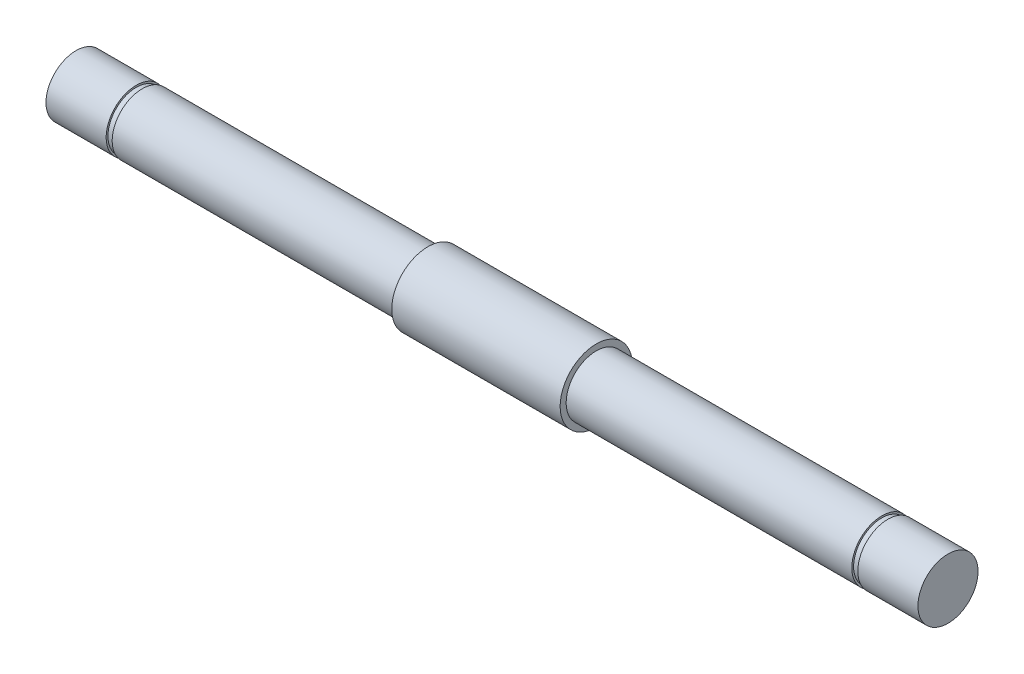
ISO-10303-21;
HEADER;
FILE_DESCRIPTION(('STEP AP214'),'2;1');
FILE_NAME('part.step','',(''),(''),'','','');
FILE_SCHEMA(('AUTOMOTIVE_DESIGN { 1 0 10303 214 1 1 1 1 }'));
ENDSEC;
DATA;
#1=APPLICATION_CONTEXT('core data for automotive mechanical design processes');
#2=APPLICATION_PROTOCOL_DEFINITION('international standard','automotive_design',2000,#1);
#3=PRODUCT_CONTEXT('',#1,'mechanical');
#4=PRODUCT('Part','Part','',(#3));
#5=PRODUCT_RELATED_PRODUCT_CATEGORY('part','',(#4));
#6=PRODUCT_DEFINITION_FORMATION('','',#4);
#7=PRODUCT_DEFINITION_CONTEXT('part definition',#1,'design');
#8=PRODUCT_DEFINITION('design','',#6,#7);
#9=PRODUCT_DEFINITION_SHAPE('','',#8);
#10=(LENGTH_UNIT() NAMED_UNIT(*) SI_UNIT(.MILLI.,.METRE.));
#11=(NAMED_UNIT(*) PLANE_ANGLE_UNIT() SI_UNIT($,.RADIAN.));
#12=(NAMED_UNIT(*) SI_UNIT($,.STERADIAN.) SOLID_ANGLE_UNIT());
#13=UNCERTAINTY_MEASURE_WITH_UNIT(LENGTH_MEASURE(1.E-05),#10,'distance_accuracy_value','');
#14=(GEOMETRIC_REPRESENTATION_CONTEXT(3) GLOBAL_UNCERTAINTY_ASSIGNED_CONTEXT((#13)) GLOBAL_UNIT_ASSIGNED_CONTEXT((#10,
#11,#12)) REPRESENTATION_CONTEXT('',''));
#15=CARTESIAN_POINT('',(0.,0.,0.));
#16=DIRECTION('',(0.,0.,1.));
#17=DIRECTION('',(1.,0.,0.));
#18=AXIS2_PLACEMENT_3D('',#15,#16,#17);
#19=CARTESIAN_POINT('',(72.5,1.4696803016871E-13,0.));
#20=DIRECTION('',(-1.,0.,0.));
#21=DIRECTION('',(0.,0.,1.));
#22=AXIS2_PLACEMENT_3D('',#19,#20,#21);
#23=PLANE('',#22);
#24=CARTESIAN_POINT('',(72.5,0.,0.));
#25=DIRECTION('',(-1.,0.,0.));
#26=DIRECTION('',(0.,0.,1.));
#27=AXIS2_PLACEMENT_3D('',#24,#25,#26);
#28=CIRCLE('',#27,5.00000000000014);
#29=CARTESIAN_POINT('',(72.5,0.,5.00000000000014));
#30=VERTEX_POINT('',#29);
#31=EDGE_CURVE('E10',#30,#30,#28,.T.);
#32=ORIENTED_EDGE('',*,*,#31,.F.);
#33=EDGE_LOOP('',(#32));
#34=FACE_BOUND('',#33,.T.);
#35=ADVANCED_FACE('F35',(#34),#23,.F.);
#36=CARTESIAN_POINT('',(0.,0.,0.));
#37=DIRECTION('',(-1.,0.,0.));
#38=DIRECTION('',(0.,0.,1.));
#39=AXIS2_PLACEMENT_3D('',#36,#37,#38);
#40=CYLINDRICAL_SURFACE('',#39,5.00000000000014);
#41=CARTESIAN_POINT('',(62.5,0.,0.));
#42=DIRECTION('',(-1.,0.,0.));
#43=DIRECTION('',(0.,0.,1.));
#44=AXIS2_PLACEMENT_3D('',#41,#42,#43);
#45=CIRCLE('',#44,5.00000000000014);
#46=CARTESIAN_POINT('',(62.5,0.,5.00000000000014));
#47=VERTEX_POINT('',#46);
#48=EDGE_CURVE('E41',#47,#47,#45,.T.);
#49=ORIENTED_EDGE('',*,*,#48,.F.);
#50=EDGE_LOOP('',(#49));
#51=FACE_BOUND('',#50,.T.);
#52=ORIENTED_EDGE('',*,*,#31,.T.);
#53=EDGE_LOOP('',(#52));
#54=FACE_BOUND('',#53,.T.);
#55=ADVANCED_FACE('F155',(#51,#54),#40,.T.);
#56=CARTESIAN_POINT('',(62.5,5.00000000000014,0.));
#57=DIRECTION('',(1.,0.,0.));
#58=DIRECTION('',(0.,0.,-1.));
#59=AXIS2_PLACEMENT_3D('',#56,#57,#58);
#60=PLANE('',#59);
#61=CARTESIAN_POINT('',(62.5,0.,0.));
#62=DIRECTION('',(-1.,0.,0.));
#63=DIRECTION('',(0.,0.,1.));
#64=AXIS2_PLACEMENT_3D('',#61,#62,#63);
#65=CIRCLE('',#64,4.70000000000014);
#66=CARTESIAN_POINT('',(62.5,0.,4.70000000000014));
#67=VERTEX_POINT('',#66);
#68=EDGE_CURVE('E45',#67,#67,#65,.T.);
#69=ORIENTED_EDGE('',*,*,#68,.F.);
#70=EDGE_LOOP('',(#69));
#71=FACE_BOUND('',#70,.T.);
#72=ORIENTED_EDGE('',*,*,#48,.T.);
#73=EDGE_LOOP('',(#72));
#74=FACE_BOUND('',#73,.T.);
#75=ADVANCED_FACE('F150',(#71,#74),#60,.F.);
#76=CARTESIAN_POINT('',(0.,0.,0.));
#77=DIRECTION('',(-1.,0.,0.));
#78=DIRECTION('',(0.,0.,1.));
#79=AXIS2_PLACEMENT_3D('',#76,#77,#78);
#80=CYLINDRICAL_SURFACE('',#79,4.70000000000014);
#81=CARTESIAN_POINT('',(61.5,0.,0.));
#82=DIRECTION('',(-1.,0.,0.));
#83=DIRECTION('',(0.,0.,1.));
#84=AXIS2_PLACEMENT_3D('',#81,#82,#83);
#85=CIRCLE('',#84,4.70000000000014);
#86=CARTESIAN_POINT('',(61.5,0.,4.70000000000014));
#87=VERTEX_POINT('',#86);
#88=EDGE_CURVE('E49',#87,#87,#85,.T.);
#89=ORIENTED_EDGE('',*,*,#88,.F.);
#90=EDGE_LOOP('',(#89));
#91=FACE_BOUND('',#90,.T.);
#92=ORIENTED_EDGE('',*,*,#68,.T.);
#93=EDGE_LOOP('',(#92));
#94=FACE_BOUND('',#93,.T.);
#95=ADVANCED_FACE('F144',(#91,#94),#80,.T.);
#96=CARTESIAN_POINT('',(61.5,4.70000000000014,0.));
#97=DIRECTION('',(-1.,0.,0.));
#98=DIRECTION('',(0.,0.,1.));
#99=AXIS2_PLACEMENT_3D('',#96,#97,#98);
#100=PLANE('',#99);
#101=CARTESIAN_POINT('',(61.5,0.,0.));
#102=DIRECTION('',(-1.,0.,0.));
#103=DIRECTION('',(0.,0.,1.));
#104=AXIS2_PLACEMENT_3D('',#101,#102,#103);
#105=CIRCLE('',#104,4.9999999999999);
#106=CARTESIAN_POINT('',(61.5,0.,4.9999999999999));
#107=VERTEX_POINT('',#106);
#108=EDGE_CURVE('E54',#107,#107,#105,.T.);
#109=ORIENTED_EDGE('',*,*,#108,.F.);
#110=EDGE_LOOP('',(#109));
#111=FACE_BOUND('',#110,.T.);
#112=ORIENTED_EDGE('',*,*,#88,.T.);
#113=EDGE_LOOP('',(#112));
#114=FACE_BOUND('',#113,.T.);
#115=ADVANCED_FACE('F138',(#111,#114),#100,.F.);
#116=CARTESIAN_POINT('',(0.,0.,0.));
#117=DIRECTION('',(-1.,0.,0.));
#118=DIRECTION('',(0.,0.,1.));
#119=AXIS2_PLACEMENT_3D('',#116,#117,#118);
#120=CYLINDRICAL_SURFACE('',#119,4.9999999999999);
#121=CARTESIAN_POINT('',(14.,0.,0.));
#122=DIRECTION('',(-1.,0.,0.));
#123=DIRECTION('',(0.,0.,1.));
#124=AXIS2_PLACEMENT_3D('',#121,#122,#123);
#125=CIRCLE('',#124,4.9999999999999);
#126=CARTESIAN_POINT('',(14.,0.,4.9999999999999));
#127=VERTEX_POINT('',#126);
#128=EDGE_CURVE('E57',#127,#127,#125,.T.);
#129=ORIENTED_EDGE('',*,*,#128,.F.);
#130=EDGE_LOOP('',(#129));
#131=FACE_BOUND('',#130,.T.);
#132=ORIENTED_EDGE('',*,*,#108,.T.);
#133=EDGE_LOOP('',(#132));
#134=FACE_BOUND('',#133,.T.);
#135=ADVANCED_FACE('F132',(#131,#134),#120,.T.);
#136=CARTESIAN_POINT('',(14.,6.,0.));
#137=DIRECTION('',(-1.,0.,0.));
#138=DIRECTION('',(0.,0.,1.));
#139=AXIS2_PLACEMENT_3D('',#136,#137,#138);
#140=PLANE('',#139);
#141=CARTESIAN_POINT('',(14.,0.,0.));
#142=DIRECTION('',(-1.,0.,0.));
#143=DIRECTION('',(0.,0.,1.));
#144=AXIS2_PLACEMENT_3D('',#141,#142,#143);
#145=CIRCLE('',#144,6.);
#146=CARTESIAN_POINT('',(14.,0.,6.));
#147=VERTEX_POINT('',#146);
#148=EDGE_CURVE('E60',#147,#147,#145,.T.);
#149=ORIENTED_EDGE('',*,*,#148,.F.);
#150=EDGE_LOOP('',(#149));
#151=FACE_BOUND('',#150,.T.);
#152=ORIENTED_EDGE('',*,*,#128,.T.);
#153=EDGE_LOOP('',(#152));
#154=FACE_BOUND('',#153,.T.);
#155=ADVANCED_FACE('F126',(#151,#154),#140,.F.);
#156=CARTESIAN_POINT('',(0.,0.,0.));
#157=DIRECTION('',(-1.,0.,0.));
#158=DIRECTION('',(0.,0.,1.));
#159=AXIS2_PLACEMENT_3D('',#156,#157,#158);
#160=CYLINDRICAL_SURFACE('',#159,6.);
#161=CARTESIAN_POINT('',(-14.,0.,0.));
#162=DIRECTION('',(-1.,0.,0.));
#163=DIRECTION('',(0.,0.,1.));
#164=AXIS2_PLACEMENT_3D('',#161,#162,#163);
#165=CIRCLE('',#164,6.00000000000001);
#166=CARTESIAN_POINT('',(-14.,0.,6.00000000000001));
#167=VERTEX_POINT('',#166);
#168=EDGE_CURVE('E63',#167,#167,#165,.T.);
#169=ORIENTED_EDGE('',*,*,#168,.F.);
#170=EDGE_LOOP('',(#169));
#171=FACE_BOUND('',#170,.T.);
#172=ORIENTED_EDGE('',*,*,#148,.T.);
#173=EDGE_LOOP('',(#172));
#174=FACE_BOUND('',#173,.T.);
#175=ADVANCED_FACE('F120',(#171,#174),#160,.T.);
#176=CARTESIAN_POINT('',(-14.,6.00000000000001,0.));
#177=DIRECTION('',(1.,0.,0.));
#178=DIRECTION('',(0.,0.,-1.));
#179=AXIS2_PLACEMENT_3D('',#176,#177,#178);
#180=PLANE('',#179);
#181=CARTESIAN_POINT('',(-14.,0.,0.));
#182=DIRECTION('',(-1.,0.,0.));
#183=DIRECTION('',(0.,0.,1.));
#184=AXIS2_PLACEMENT_3D('',#181,#182,#183);
#185=CIRCLE('',#184,5.);
#186=CARTESIAN_POINT('',(-14.,0.,5.));
#187=VERTEX_POINT('',#186);
#188=EDGE_CURVE('E66',#187,#187,#185,.T.);
#189=ORIENTED_EDGE('',*,*,#188,.F.);
#190=EDGE_LOOP('',(#189));
#191=FACE_BOUND('',#190,.T.);
#192=ORIENTED_EDGE('',*,*,#168,.T.);
#193=EDGE_LOOP('',(#192));
#194=FACE_BOUND('',#193,.T.);
#195=ADVANCED_FACE('F114',(#191,#194),#180,.F.);
#196=CARTESIAN_POINT('',(0.,0.,0.));
#197=DIRECTION('',(-1.,0.,0.));
#198=DIRECTION('',(0.,0.,1.));
#199=AXIS2_PLACEMENT_3D('',#196,#197,#198);
#200=CYLINDRICAL_SURFACE('',#199,5.00000000000001);
#201=CARTESIAN_POINT('',(-61.5,0.,0.));
#202=DIRECTION('',(-1.,0.,0.));
#203=DIRECTION('',(0.,0.,1.));
#204=AXIS2_PLACEMENT_3D('',#201,#202,#203);
#205=CIRCLE('',#204,5.00000000000001);
#206=CARTESIAN_POINT('',(-61.5,0.,5.00000000000001));
#207=VERTEX_POINT('',#206);
#208=EDGE_CURVE('E69',#207,#207,#205,.T.);
#209=ORIENTED_EDGE('',*,*,#208,.F.);
#210=EDGE_LOOP('',(#209));
#211=FACE_BOUND('',#210,.T.);
#212=ORIENTED_EDGE('',*,*,#188,.T.);
#213=EDGE_LOOP('',(#212));
#214=FACE_BOUND('',#213,.T.);
#215=ADVANCED_FACE('F108',(#211,#214),#200,.T.);
#216=CARTESIAN_POINT('',(-61.5,4.70000000000013,0.));
#217=DIRECTION('',(1.,0.,0.));
#218=DIRECTION('',(0.,0.,-1.));
#219=AXIS2_PLACEMENT_3D('',#216,#217,#218);
#220=PLANE('',#219);
#221=CARTESIAN_POINT('',(-61.5,0.,0.));
#222=DIRECTION('',(-1.,0.,0.));
#223=DIRECTION('',(0.,0.,1.));
#224=AXIS2_PLACEMENT_3D('',#221,#222,#223);
#225=CIRCLE('',#224,4.70000000000013);
#226=CARTESIAN_POINT('',(-61.5,0.,4.70000000000013));
#227=VERTEX_POINT('',#226);
#228=EDGE_CURVE('E72',#227,#227,#225,.T.);
#229=ORIENTED_EDGE('',*,*,#228,.F.);
#230=EDGE_LOOP('',(#229));
#231=FACE_BOUND('',#230,.T.);
#232=ORIENTED_EDGE('',*,*,#208,.T.);
#233=EDGE_LOOP('',(#232));
#234=FACE_BOUND('',#233,.T.);
#235=ADVANCED_FACE('F102',(#231,#234),#220,.F.);
#236=CARTESIAN_POINT('',(0.,0.,0.));
#237=DIRECTION('',(-1.,0.,0.));
#238=DIRECTION('',(0.,0.,1.));
#239=AXIS2_PLACEMENT_3D('',#236,#237,#238);
#240=CYLINDRICAL_SURFACE('',#239,4.70000000000013);
#241=CARTESIAN_POINT('',(-62.5,0.,0.));
#242=DIRECTION('',(-1.,0.,0.));
#243=DIRECTION('',(0.,0.,1.));
#244=AXIS2_PLACEMENT_3D('',#241,#242,#243);
#245=CIRCLE('',#244,4.70000000000014);
#246=CARTESIAN_POINT('',(-62.5,0.,4.70000000000014));
#247=VERTEX_POINT('',#246);
#248=EDGE_CURVE('E75',#247,#247,#245,.T.);
#249=ORIENTED_EDGE('',*,*,#248,.F.);
#250=EDGE_LOOP('',(#249));
#251=FACE_BOUND('',#250,.T.);
#252=ORIENTED_EDGE('',*,*,#228,.T.);
#253=EDGE_LOOP('',(#252));
#254=FACE_BOUND('',#253,.T.);
#255=ADVANCED_FACE('F96',(#251,#254),#240,.T.);
#256=CARTESIAN_POINT('',(-62.5,5.00000000000014,0.));
#257=DIRECTION('',(-1.,0.,0.));
#258=DIRECTION('',(0.,0.,1.));
#259=AXIS2_PLACEMENT_3D('',#256,#257,#258);
#260=PLANE('',#259);
#261=CARTESIAN_POINT('',(-62.5,0.,0.));
#262=DIRECTION('',(-1.,0.,0.));
#263=DIRECTION('',(0.,0.,1.));
#264=AXIS2_PLACEMENT_3D('',#261,#262,#263);
#265=CIRCLE('',#264,5.00000000000014);
#266=CARTESIAN_POINT('',(-62.5,0.,5.00000000000014));
#267=VERTEX_POINT('',#266);
#268=EDGE_CURVE('E78',#267,#267,#265,.T.);
#269=ORIENTED_EDGE('',*,*,#268,.F.);
#270=EDGE_LOOP('',(#269));
#271=FACE_BOUND('',#270,.T.);
#272=ORIENTED_EDGE('',*,*,#248,.T.);
#273=EDGE_LOOP('',(#272));
#274=FACE_BOUND('',#273,.T.);
#275=ADVANCED_FACE('F90',(#271,#274),#260,.F.);
#276=CARTESIAN_POINT('',(0.,0.,0.));
#277=DIRECTION('',(-1.,0.,0.));
#278=DIRECTION('',(0.,0.,1.));
#279=AXIS2_PLACEMENT_3D('',#276,#277,#278);
#280=CYLINDRICAL_SURFACE('',#279,5.00000000000014);
#281=CARTESIAN_POINT('',(-72.5,0.,0.));
#282=DIRECTION('',(-1.,0.,0.));
#283=DIRECTION('',(0.,0.,1.));
#284=AXIS2_PLACEMENT_3D('',#281,#282,#283);
#285=CIRCLE('',#284,5.00000000000014);
#286=CARTESIAN_POINT('',(-72.5,0.,5.00000000000014));
#287=VERTEX_POINT('',#286);
#288=EDGE_CURVE('E81',#287,#287,#285,.T.);
#289=ORIENTED_EDGE('',*,*,#288,.F.);
#290=EDGE_LOOP('',(#289));
#291=FACE_BOUND('',#290,.T.);
#292=ORIENTED_EDGE('',*,*,#268,.T.);
#293=EDGE_LOOP('',(#292));
#294=FACE_BOUND('',#293,.T.);
#295=ADVANCED_FACE('F87',(#291,#294),#280,.T.);
#296=CARTESIAN_POINT('',(-72.5,5.00000000000014,0.));
#297=DIRECTION('',(1.,0.,0.));
#298=DIRECTION('',(0.,0.,-1.));
#299=AXIS2_PLACEMENT_3D('',#296,#297,#298);
#300=PLANE('',#299);
#301=ORIENTED_EDGE('',*,*,#288,.T.);
#302=EDGE_LOOP('',(#301));
#303=FACE_BOUND('',#302,.T.);
#304=ADVANCED_FACE('F85',(#303),#300,.F.);
#305=CLOSED_SHELL('',(#35,#55,#75,#95,#115,#135,#155,#175,#195,#215,#235,#255,#275,#295,#304));
#306=MANIFOLD_SOLID_BREP('B2',#305);
#307=ADVANCED_BREP_SHAPE_REPRESENTATION('',(#18,#306),#14);
#308=SHAPE_DEFINITION_REPRESENTATION(#9,#307);
ENDSEC;
END-ISO-10303-21;
